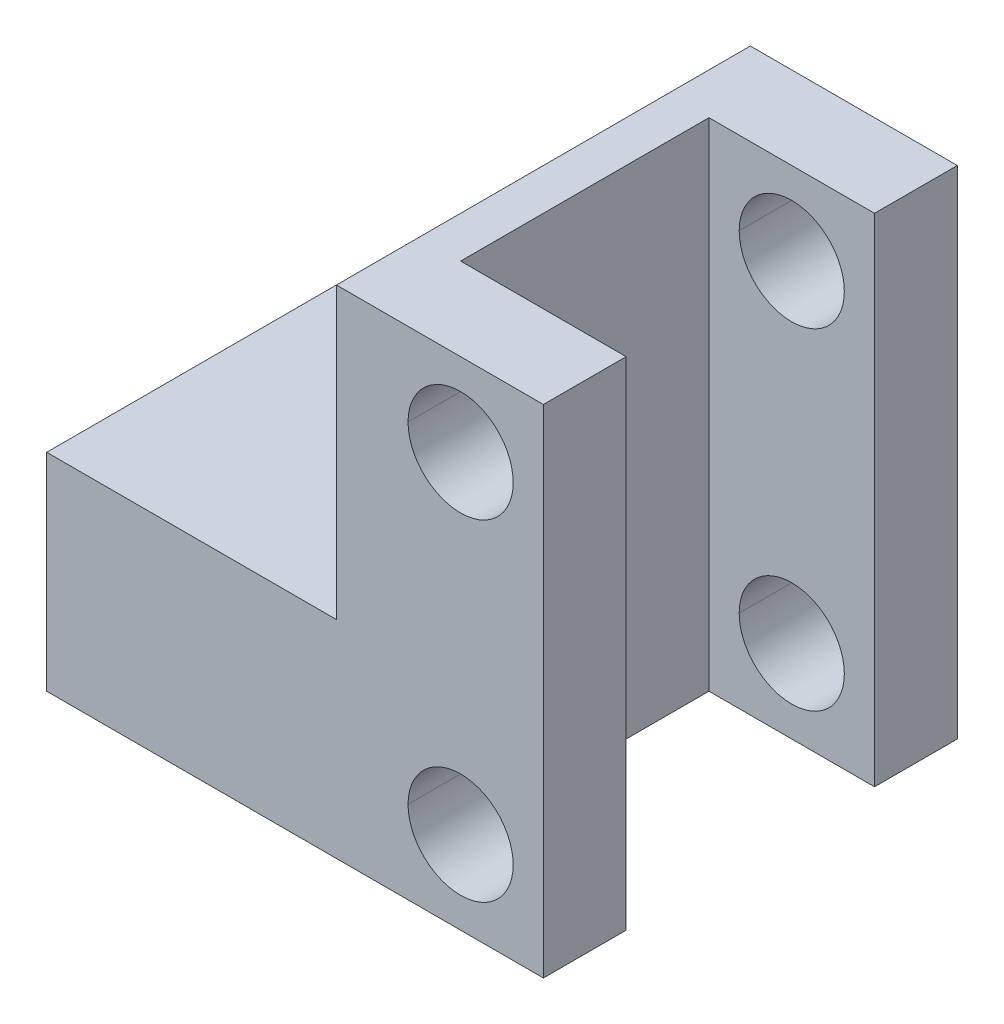
ISO-10303-21;
HEADER;
FILE_DESCRIPTION(('STEP AP214'),'2;1');
FILE_NAME('part.step','',(''),(''),'','','');
FILE_SCHEMA(('AUTOMOTIVE_DESIGN { 1 0 10303 214 1 1 1 1 }'));
ENDSEC;
DATA;
#1=APPLICATION_CONTEXT('core data for automotive mechanical design processes');
#2=APPLICATION_PROTOCOL_DEFINITION('international standard','automotive_design',2000,#1);
#3=PRODUCT_CONTEXT('',#1,'mechanical');
#4=PRODUCT('Part','Part','',(#3));
#5=PRODUCT_RELATED_PRODUCT_CATEGORY('part','',(#4));
#6=PRODUCT_DEFINITION_FORMATION('','',#4);
#7=PRODUCT_DEFINITION_CONTEXT('part definition',#1,'design');
#8=PRODUCT_DEFINITION('design','',#6,#7);
#9=PRODUCT_DEFINITION_SHAPE('','',#8);
#10=(LENGTH_UNIT() NAMED_UNIT(*) SI_UNIT(.MILLI.,.METRE.));
#11=(NAMED_UNIT(*) PLANE_ANGLE_UNIT() SI_UNIT($,.RADIAN.));
#12=(NAMED_UNIT(*) SI_UNIT($,.STERADIAN.) SOLID_ANGLE_UNIT());
#13=UNCERTAINTY_MEASURE_WITH_UNIT(LENGTH_MEASURE(1.E-05),#10,'distance_accuracy_value','');
#14=(GEOMETRIC_REPRESENTATION_CONTEXT(3) GLOBAL_UNCERTAINTY_ASSIGNED_CONTEXT((#13)) GLOBAL_UNIT_ASSIGNED_CONTEXT((#10,
#11,#12)) REPRESENTATION_CONTEXT('',''));
#15=CARTESIAN_POINT('',(0.,0.,0.));
#16=DIRECTION('',(0.,0.,1.));
#17=DIRECTION('',(1.,0.,0.));
#18=AXIS2_PLACEMENT_3D('',#15,#16,#17);
#19=CARTESIAN_POINT('',(20.,-20.,60.));
#20=DIRECTION('',(0.,0.,-1.));
#21=DIRECTION('',(-1.,0.,0.));
#22=AXIS2_PLACEMENT_3D('',#19,#20,#21);
#23=CYLINDRICAL_SURFACE('',#22,6.35);
#24=DIRECTION('',(0.,0.,-1.));
#25=VECTOR('',#24,1.);
#26=CARTESIAN_POINT('',(26.35,-20.,60.));
#27=LINE('',#26,#25);
#28=CARTESIAN_POINT('',(26.35,-20.,10.));
#29=VERTEX_POINT('',#28);
#30=CARTESIAN_POINT('',(26.35,-20.,0.));
#31=VERTEX_POINT('',#30);
#32=EDGE_CURVE('E191',#29,#31,#27,.T.);
#33=ORIENTED_EDGE('',*,*,#32,.F.);
#34=CARTESIAN_POINT('',(20.,-20.,10.));
#35=DIRECTION('',(0.,0.,1.));
#36=DIRECTION('',(-1.,0.,0.));
#37=AXIS2_PLACEMENT_3D('',#34,#35,#36);
#38=CIRCLE('',#37,6.35);
#39=CARTESIAN_POINT('',(13.65,-20.,10.));
#40=VERTEX_POINT('',#39);
#41=EDGE_CURVE('E177',#29,#40,#38,.T.);
#42=ORIENTED_EDGE('',*,*,#41,.T.);
#43=DIRECTION('',(0.,0.,-1.));
#44=VECTOR('',#43,1.);
#45=CARTESIAN_POINT('',(13.65,-20.,60.));
#46=LINE('',#45,#44);
#47=CARTESIAN_POINT('',(13.65,-20.,0.));
#48=VERTEX_POINT('',#47);
#49=EDGE_CURVE('E200',#40,#48,#46,.T.);
#50=ORIENTED_EDGE('',*,*,#49,.T.);
#51=CARTESIAN_POINT('',(20.,-20.,0.));
#52=DIRECTION('',(0.,0.,1.));
#53=DIRECTION('',(-1.,0.,0.));
#54=AXIS2_PLACEMENT_3D('',#51,#52,#53);
#55=CIRCLE('',#54,6.35);
#56=EDGE_CURVE('E192',#31,#48,#55,.T.);
#57=ORIENTED_EDGE('',*,*,#56,.F.);
#58=EDGE_LOOP('',(#33,#42,#50,#57));
#59=FACE_BOUND('',#58,.T.);
#60=ADVANCED_FACE('F16',(#59),#23,.F.);
#61=CARTESIAN_POINT('',(20.,20.,60.));
#62=DIRECTION('',(0.,0.,-1.));
#63=DIRECTION('',(-1.,0.,0.));
#64=AXIS2_PLACEMENT_3D('',#61,#62,#63);
#65=CYLINDRICAL_SURFACE('',#64,6.35);
#66=DIRECTION('',(0.,0.,-1.));
#67=VECTOR('',#66,1.);
#68=CARTESIAN_POINT('',(26.35,20.,60.));
#69=LINE('',#68,#67);
#70=CARTESIAN_POINT('',(26.35,20.,10.));
#71=VERTEX_POINT('',#70);
#72=CARTESIAN_POINT('',(26.35,20.,0.));
#73=VERTEX_POINT('',#72);
#74=EDGE_CURVE('E330',#71,#73,#69,.T.);
#75=ORIENTED_EDGE('',*,*,#74,.F.);
#76=CARTESIAN_POINT('',(20.,20.,10.));
#77=DIRECTION('',(0.,0.,1.));
#78=DIRECTION('',(-1.,0.,0.));
#79=AXIS2_PLACEMENT_3D('',#76,#77,#78);
#80=CIRCLE('',#79,6.35);
#81=CARTESIAN_POINT('',(13.65,20.,10.));
#82=VERTEX_POINT('',#81);
#83=EDGE_CURVE('E187',#71,#82,#80,.T.);
#84=ORIENTED_EDGE('',*,*,#83,.T.);
#85=DIRECTION('',(0.,0.,-1.));
#86=VECTOR('',#85,1.);
#87=CARTESIAN_POINT('',(13.65,20.,60.));
#88=LINE('',#87,#86);
#89=CARTESIAN_POINT('',(13.65,20.,0.));
#90=VERTEX_POINT('',#89);
#91=EDGE_CURVE('E216',#82,#90,#88,.T.);
#92=ORIENTED_EDGE('',*,*,#91,.T.);
#93=CARTESIAN_POINT('',(20.,20.,0.));
#94=DIRECTION('',(0.,0.,1.));
#95=DIRECTION('',(-1.,0.,0.));
#96=AXIS2_PLACEMENT_3D('',#93,#94,#95);
#97=CIRCLE('',#96,6.35);
#98=EDGE_CURVE('E245',#73,#90,#97,.T.);
#99=ORIENTED_EDGE('',*,*,#98,.F.);
#100=EDGE_LOOP('',(#75,#84,#92,#99));
#101=FACE_BOUND('',#100,.T.);
#102=ADVANCED_FACE('F620',(#101),#65,.F.);
#103=CARTESIAN_POINT('',(20.,-20.,60.));
#104=DIRECTION('',(0.,0.,-1.));
#105=DIRECTION('',(-1.,0.,0.));
#106=AXIS2_PLACEMENT_3D('',#103,#104,#105);
#107=CYLINDRICAL_SURFACE('',#106,6.35);
#108=DIRECTION('',(0.,0.,-1.));
#109=VECTOR('',#108,1.);
#110=CARTESIAN_POINT('',(26.35,-20.,60.));
#111=LINE('',#110,#109);
#112=CARTESIAN_POINT('',(26.35,-20.,-30.));
#113=VERTEX_POINT('',#112);
#114=CARTESIAN_POINT('',(26.35,-20.,-40.));
#115=VERTEX_POINT('',#114);
#116=EDGE_CURVE('E231',#113,#115,#111,.T.);
#117=ORIENTED_EDGE('',*,*,#116,.F.);
#118=CARTESIAN_POINT('',(20.,-20.,-30.));
#119=DIRECTION('',(0.,0.,1.));
#120=DIRECTION('',(-1.,0.,0.));
#121=AXIS2_PLACEMENT_3D('',#118,#119,#120);
#122=CIRCLE('',#121,6.35);
#123=CARTESIAN_POINT('',(13.65,-20.,-30.));
#124=VERTEX_POINT('',#123);
#125=EDGE_CURVE('E250',#113,#124,#122,.T.);
#126=ORIENTED_EDGE('',*,*,#125,.T.);
#127=DIRECTION('',(0.,0.,-1.));
#128=VECTOR('',#127,1.);
#129=CARTESIAN_POINT('',(13.65,-20.,60.));
#130=LINE('',#129,#128);
#131=CARTESIAN_POINT('',(13.65,-20.,-40.));
#132=VERTEX_POINT('',#131);
#133=EDGE_CURVE('E222',#124,#132,#130,.T.);
#134=ORIENTED_EDGE('',*,*,#133,.T.);
#135=CARTESIAN_POINT('',(20.,-20.,-40.));
#136=DIRECTION('',(0.,0.,1.));
#137=DIRECTION('',(1.,0.,0.));
#138=AXIS2_PLACEMENT_3D('',#135,#136,#137);
#139=CIRCLE('',#138,6.35);
#140=EDGE_CURVE('E27',#115,#132,#139,.T.);
#141=ORIENTED_EDGE('',*,*,#140,.F.);
#142=EDGE_LOOP('',(#117,#126,#134,#141));
#143=FACE_BOUND('',#142,.T.);
#144=ADVANCED_FACE('F18',(#143),#107,.F.);
#145=CARTESIAN_POINT('',(20.,20.,60.));
#146=DIRECTION('',(0.,0.,-1.));
#147=DIRECTION('',(-1.,0.,0.));
#148=AXIS2_PLACEMENT_3D('',#145,#146,#147);
#149=CYLINDRICAL_SURFACE('',#148,6.35);
#150=DIRECTION('',(0.,0.,-1.));
#151=VECTOR('',#150,1.);
#152=CARTESIAN_POINT('',(26.35,20.,60.));
#153=LINE('',#152,#151);
#154=CARTESIAN_POINT('',(26.35,20.,-30.));
#155=VERTEX_POINT('',#154);
#156=CARTESIAN_POINT('',(26.35,20.,-40.));
#157=VERTEX_POINT('',#156);
#158=EDGE_CURVE('E209',#155,#157,#153,.T.);
#159=ORIENTED_EDGE('',*,*,#158,.F.);
#160=CARTESIAN_POINT('',(20.,20.,-30.));
#161=DIRECTION('',(0.,0.,1.));
#162=DIRECTION('',(-1.,0.,0.));
#163=AXIS2_PLACEMENT_3D('',#160,#161,#162);
#164=CIRCLE('',#163,6.35);
#165=CARTESIAN_POINT('',(13.65,20.,-30.));
#166=VERTEX_POINT('',#165);
#167=EDGE_CURVE('E246',#155,#166,#164,.T.);
#168=ORIENTED_EDGE('',*,*,#167,.T.);
#169=DIRECTION('',(0.,0.,-1.));
#170=VECTOR('',#169,1.);
#171=CARTESIAN_POINT('',(13.65,20.,60.));
#172=LINE('',#171,#170);
#173=CARTESIAN_POINT('',(13.65,20.,-40.));
#174=VERTEX_POINT('',#173);
#175=EDGE_CURVE('E288',#166,#174,#172,.T.);
#176=ORIENTED_EDGE('',*,*,#175,.T.);
#177=CARTESIAN_POINT('',(20.,20.,-40.));
#178=DIRECTION('',(0.,0.,1.));
#179=DIRECTION('',(1.,0.,0.));
#180=AXIS2_PLACEMENT_3D('',#177,#178,#179);
#181=CIRCLE('',#180,6.35);
#182=EDGE_CURVE('E11',#157,#174,#181,.T.);
#183=ORIENTED_EDGE('',*,*,#182,.F.);
#184=EDGE_LOOP('',(#159,#168,#176,#183));
#185=FACE_BOUND('',#184,.T.);
#186=ADVANCED_FACE('F642',(#185),#149,.F.);
#187=CARTESIAN_POINT('',(0.,0.,-40.));
#188=DIRECTION('',(0.,0.,-1.));
#189=DIRECTION('',(0.,-1.,0.));
#190=AXIS2_PLACEMENT_3D('',#187,#188,#189);
#191=PLANE('',#190);
#192=CARTESIAN_POINT('',(20.,20.,-40.));
#193=DIRECTION('',(0.,0.,1.));
#194=DIRECTION('',(1.,0.,0.));
#195=AXIS2_PLACEMENT_3D('',#192,#193,#194);
#196=CIRCLE('',#195,6.35);
#197=EDGE_CURVE('E20',#174,#157,#196,.T.);
#198=ORIENTED_EDGE('',*,*,#197,.T.);
#199=ORIENTED_EDGE('',*,*,#182,.T.);
#200=EDGE_LOOP('',(#198,#199));
#201=FACE_BOUND('',#200,.T.);
#202=CARTESIAN_POINT('',(20.,-20.,-40.));
#203=DIRECTION('',(0.,0.,1.));
#204=DIRECTION('',(1.,0.,0.));
#205=AXIS2_PLACEMENT_3D('',#202,#203,#204);
#206=CIRCLE('',#205,6.35);
#207=EDGE_CURVE('E227',#132,#115,#206,.T.);
#208=ORIENTED_EDGE('',*,*,#207,.T.);
#209=ORIENTED_EDGE('',*,*,#140,.T.);
#210=EDGE_LOOP('',(#208,#209));
#211=FACE_BOUND('',#210,.T.);
#212=DIRECTION('',(0.,-1.,0.));
#213=VECTOR('',#212,1.);
#214=CARTESIAN_POINT('',(30.,30.,-40.));
#215=LINE('',#214,#213);
#216=CARTESIAN_POINT('',(30.,30.,-40.));
#217=VERTEX_POINT('',#216);
#218=CARTESIAN_POINT('',(30.,-30.,-40.));
#219=VERTEX_POINT('',#218);
#220=EDGE_CURVE('E249',#217,#219,#215,.T.);
#221=ORIENTED_EDGE('',*,*,#220,.T.);
#222=DIRECTION('',(-1.,0.,0.));
#223=VECTOR('',#222,1.);
#224=CARTESIAN_POINT('',(30.,-30.,-40.));
#225=LINE('',#224,#223);
#226=CARTESIAN_POINT('',(-30.,-30.,-40.));
#227=VERTEX_POINT('',#226);
#228=EDGE_CURVE('E278',#219,#227,#225,.T.);
#229=ORIENTED_EDGE('',*,*,#228,.T.);
#230=DIRECTION('',(0.,1.,0.));
#231=VECTOR('',#230,1.);
#232=CARTESIAN_POINT('',(-30.,-5.,-40.));
#233=LINE('',#232,#231);
#234=CARTESIAN_POINT('',(-30.,-5.,-40.));
#235=VERTEX_POINT('',#234);
#236=EDGE_CURVE('E260',#227,#235,#233,.T.);
#237=ORIENTED_EDGE('',*,*,#236,.T.);
#238=DIRECTION('',(1.,0.,0.));
#239=VECTOR('',#238,1.);
#240=CARTESIAN_POINT('',(5.,-5.,-40.));
#241=LINE('',#240,#239);
#242=CARTESIAN_POINT('',(5.,-5.,-40.));
#243=VERTEX_POINT('',#242);
#244=EDGE_CURVE('E244',#235,#243,#241,.T.);
#245=ORIENTED_EDGE('',*,*,#244,.T.);
#246=DIRECTION('',(0.,1.,0.));
#247=VECTOR('',#246,1.);
#248=CARTESIAN_POINT('',(5.,-5.,-40.));
#249=LINE('',#248,#247);
#250=CARTESIAN_POINT('',(5.,30.,-40.));
#251=VERTEX_POINT('',#250);
#252=EDGE_CURVE('E42',#243,#251,#249,.T.);
#253=ORIENTED_EDGE('',*,*,#252,.T.);
#254=DIRECTION('',(1.,0.,0.));
#255=VECTOR('',#254,1.);
#256=CARTESIAN_POINT('',(30.,30.,-40.));
#257=LINE('',#256,#255);
#258=EDGE_CURVE('E341',#251,#217,#257,.T.);
#259=ORIENTED_EDGE('',*,*,#258,.T.);
#260=EDGE_LOOP('',(#221,#229,#237,#245,#253,#259));
#261=FACE_BOUND('',#260,.T.);
#262=ADVANCED_FACE('F366',(#201,#211,#261),#191,.T.);
#263=CARTESIAN_POINT('',(30.,30.,-40.));
#264=DIRECTION('',(-1.,0.,0.));
#265=DIRECTION('',(0.,0.,1.));
#266=AXIS2_PLACEMENT_3D('',#263,#264,#265);
#267=PLANE('',#266);
#268=DIRECTION('',(0.,-1.,0.));
#269=VECTOR('',#268,1.);
#270=CARTESIAN_POINT('',(30.,30.,-30.));
#271=LINE('',#270,#269);
#272=CARTESIAN_POINT('',(30.,30.,-30.));
#273=VERTEX_POINT('',#272);
#274=CARTESIAN_POINT('',(30.,-30.,-30.));
#275=VERTEX_POINT('',#274);
#276=EDGE_CURVE('E234',#273,#275,#271,.T.);
#277=ORIENTED_EDGE('',*,*,#276,.T.);
#278=DIRECTION('',(0.,0.,1.));
#279=VECTOR('',#278,1.);
#280=CARTESIAN_POINT('',(30.,-30.,-40.));
#281=LINE('',#280,#279);
#282=EDGE_CURVE('E273',#219,#275,#281,.T.);
#283=ORIENTED_EDGE('',*,*,#282,.F.);
#284=ORIENTED_EDGE('',*,*,#220,.F.);
#285=DIRECTION('',(0.,0.,1.));
#286=VECTOR('',#285,1.);
#287=CARTESIAN_POINT('',(30.,30.,-40.));
#288=LINE('',#287,#286);
#289=EDGE_CURVE('E295',#217,#273,#288,.T.);
#290=ORIENTED_EDGE('',*,*,#289,.T.);
#291=EDGE_LOOP('',(#277,#283,#284,#290));
#292=FACE_BOUND('',#291,.T.);
#293=ADVANCED_FACE('F641',(#292),#267,.F.);
#294=CARTESIAN_POINT('',(0.,0.,-30.));
#295=DIRECTION('',(0.,0.,-1.));
#296=DIRECTION('',(0.,-1.,0.));
#297=AXIS2_PLACEMENT_3D('',#294,#295,#296);
#298=PLANE('',#297);
#299=CARTESIAN_POINT('',(20.,20.,-30.));
#300=DIRECTION('',(0.,0.,1.));
#301=DIRECTION('',(-1.,0.,0.));
#302=AXIS2_PLACEMENT_3D('',#299,#300,#301);
#303=CIRCLE('',#302,6.35);
#304=EDGE_CURVE('E226',#166,#155,#303,.T.);
#305=ORIENTED_EDGE('',*,*,#304,.F.);
#306=ORIENTED_EDGE('',*,*,#167,.F.);
#307=EDGE_LOOP('',(#305,#306));
#308=FACE_BOUND('',#307,.T.);
#309=CARTESIAN_POINT('',(20.,-20.,-30.));
#310=DIRECTION('',(0.,0.,1.));
#311=DIRECTION('',(-1.,0.,0.));
#312=AXIS2_PLACEMENT_3D('',#309,#310,#311);
#313=CIRCLE('',#312,6.35);
#314=EDGE_CURVE('E220',#124,#113,#313,.T.);
#315=ORIENTED_EDGE('',*,*,#314,.F.);
#316=ORIENTED_EDGE('',*,*,#125,.F.);
#317=EDGE_LOOP('',(#315,#316));
#318=FACE_BOUND('',#317,.T.);
#319=DIRECTION('',(1.,0.,0.));
#320=VECTOR('',#319,1.);
#321=CARTESIAN_POINT('',(30.,30.,-30.));
#322=LINE('',#321,#320);
#323=CARTESIAN_POINT('',(10.,30.,-30.));
#324=VERTEX_POINT('',#323);
#325=EDGE_CURVE('E255',#324,#273,#322,.T.);
#326=ORIENTED_EDGE('',*,*,#325,.F.);
#327=DIRECTION('',(0.,-1.,0.));
#328=VECTOR('',#327,1.);
#329=CARTESIAN_POINT('',(10.,30.,-30.));
#330=LINE('',#329,#328);
#331=CARTESIAN_POINT('',(10.,-30.,-30.));
#332=VERTEX_POINT('',#331);
#333=EDGE_CURVE('E235',#324,#332,#330,.T.);
#334=ORIENTED_EDGE('',*,*,#333,.T.);
#335=DIRECTION('',(-1.,0.,0.));
#336=VECTOR('',#335,1.);
#337=CARTESIAN_POINT('',(30.,-30.,-30.));
#338=LINE('',#337,#336);
#339=EDGE_CURVE('E277',#275,#332,#338,.T.);
#340=ORIENTED_EDGE('',*,*,#339,.F.);
#341=ORIENTED_EDGE('',*,*,#276,.F.);
#342=EDGE_LOOP('',(#326,#334,#340,#341));
#343=FACE_BOUND('',#342,.T.);
#344=ADVANCED_FACE('F633',(#308,#318,#343),#298,.F.);
#345=CARTESIAN_POINT('',(5.,-5.,10.));
#346=DIRECTION('',(-1.,0.,0.));
#347=DIRECTION('',(0.,1.,0.));
#348=AXIS2_PLACEMENT_3D('',#345,#346,#347);
#349=PLANE('',#348);
#350=DIRECTION('',(0.,0.,-1.));
#351=VECTOR('',#350,1.);
#352=CARTESIAN_POINT('',(5.,30.,10.));
#353=LINE('',#352,#351);
#354=CARTESIAN_POINT('',(5.,30.,10.));
#355=VERTEX_POINT('',#354);
#356=EDGE_CURVE('E272',#355,#251,#353,.T.);
#357=ORIENTED_EDGE('',*,*,#356,.T.);
#358=ORIENTED_EDGE('',*,*,#252,.F.);
#359=DIRECTION('',(0.,0.,-1.));
#360=VECTOR('',#359,1.);
#361=CARTESIAN_POINT('',(5.,-5.,10.));
#362=LINE('',#361,#360);
#363=CARTESIAN_POINT('',(5.,-5.,10.));
#364=VERTEX_POINT('',#363);
#365=EDGE_CURVE('E240',#364,#243,#362,.T.);
#366=ORIENTED_EDGE('',*,*,#365,.F.);
#367=DIRECTION('',(0.,1.,0.));
#368=VECTOR('',#367,1.);
#369=CARTESIAN_POINT('',(5.,-5.,10.));
#370=LINE('',#369,#368);
#371=EDGE_CURVE('E305',#364,#355,#370,.T.);
#372=ORIENTED_EDGE('',*,*,#371,.T.);
#373=EDGE_LOOP('',(#357,#358,#366,#372));
#374=FACE_BOUND('',#373,.T.);
#375=ADVANCED_FACE('F629',(#374),#349,.T.);
#376=CARTESIAN_POINT('',(10.,30.,10.));
#377=DIRECTION('',(1.,0.,0.));
#378=DIRECTION('',(0.,1.,0.));
#379=AXIS2_PLACEMENT_3D('',#376,#377,#378);
#380=PLANE('',#379);
#381=DIRECTION('',(0.,0.,-1.));
#382=VECTOR('',#381,1.);
#383=CARTESIAN_POINT('',(10.,30.,10.));
#384=LINE('',#383,#382);
#385=CARTESIAN_POINT('',(10.,30.,0.));
#386=VERTEX_POINT('',#385);
#387=EDGE_CURVE('E251',#386,#324,#384,.T.);
#388=ORIENTED_EDGE('',*,*,#387,.F.);
#389=DIRECTION('',(0.,-1.,0.));
#390=VECTOR('',#389,1.);
#391=CARTESIAN_POINT('',(10.,0.,0.));
#392=LINE('',#391,#390);
#393=CARTESIAN_POINT('',(10.,-30.,0.));
#394=VERTEX_POINT('',#393);
#395=EDGE_CURVE('E335',#386,#394,#392,.T.);
#396=ORIENTED_EDGE('',*,*,#395,.T.);
#397=DIRECTION('',(0.,0.,-1.));
#398=VECTOR('',#397,1.);
#399=CARTESIAN_POINT('',(10.,-30.,10.));
#400=LINE('',#399,#398);
#401=EDGE_CURVE('E299',#394,#332,#400,.T.);
#402=ORIENTED_EDGE('',*,*,#401,.T.);
#403=ORIENTED_EDGE('',*,*,#333,.F.);
#404=EDGE_LOOP('',(#388,#396,#402,#403));
#405=FACE_BOUND('',#404,.T.);
#406=ADVANCED_FACE('F417',(#405),#380,.T.);
#407=CARTESIAN_POINT('',(10.,-5.,-30.));
#408=DIRECTION('',(0.,-1.,0.));
#409=DIRECTION('',(0.,0.,-1.));
#410=AXIS2_PLACEMENT_3D('',#407,#408,#409);
#411=PLANE('',#410);
#412=DIRECTION('',(1.,0.,0.));
#413=VECTOR('',#412,1.);
#414=CARTESIAN_POINT('',(10.,-5.,10.));
#415=LINE('',#414,#413);
#416=CARTESIAN_POINT('',(-30.,-5.,10.));
#417=VERTEX_POINT('',#416);
#418=EDGE_CURVE('E188',#417,#364,#415,.T.);
#419=ORIENTED_EDGE('',*,*,#418,.T.);
#420=ORIENTED_EDGE('',*,*,#365,.T.);
#421=ORIENTED_EDGE('',*,*,#244,.F.);
#422=DIRECTION('',(0.,0.,1.));
#423=VECTOR('',#422,1.);
#424=CARTESIAN_POINT('',(-30.,-5.,-30.));
#425=LINE('',#424,#423);
#426=EDGE_CURVE('E257',#235,#417,#425,.T.);
#427=ORIENTED_EDGE('',*,*,#426,.T.);
#428=EDGE_LOOP('',(#419,#420,#421,#427));
#429=FACE_BOUND('',#428,.T.);
#430=ADVANCED_FACE('F408',(#429),#411,.F.);
#431=CARTESIAN_POINT('',(0.,0.,0.));
#432=DIRECTION('',(0.,0.,-1.));
#433=DIRECTION('',(0.,-1.,0.));
#434=AXIS2_PLACEMENT_3D('',#431,#432,#433);
#435=PLANE('',#434);
#436=CARTESIAN_POINT('',(20.,20.,0.));
#437=DIRECTION('',(0.,0.,1.));
#438=DIRECTION('',(-1.,0.,0.));
#439=AXIS2_PLACEMENT_3D('',#436,#437,#438);
#440=CIRCLE('',#439,6.35);
#441=EDGE_CURVE('E221',#90,#73,#440,.T.);
#442=ORIENTED_EDGE('',*,*,#441,.T.);
#443=ORIENTED_EDGE('',*,*,#98,.T.);
#444=EDGE_LOOP('',(#442,#443));
#445=FACE_BOUND('',#444,.T.);
#446=CARTESIAN_POINT('',(20.,-20.,0.));
#447=DIRECTION('',(0.,0.,1.));
#448=DIRECTION('',(-1.,0.,0.));
#449=AXIS2_PLACEMENT_3D('',#446,#447,#448);
#450=CIRCLE('',#449,6.35);
#451=EDGE_CURVE('E197',#48,#31,#450,.T.);
#452=ORIENTED_EDGE('',*,*,#451,.T.);
#453=ORIENTED_EDGE('',*,*,#56,.T.);
#454=EDGE_LOOP('',(#452,#453));
#455=FACE_BOUND('',#454,.T.);
#456=DIRECTION('',(1.,0.,0.));
#457=VECTOR('',#456,1.);
#458=CARTESIAN_POINT('',(-30.,-30.,0.));
#459=LINE('',#458,#457);
#460=CARTESIAN_POINT('',(30.,-30.,0.));
#461=VERTEX_POINT('',#460);
#462=EDGE_CURVE('E303',#394,#461,#459,.T.);
#463=ORIENTED_EDGE('',*,*,#462,.F.);
#464=ORIENTED_EDGE('',*,*,#395,.F.);
#465=DIRECTION('',(-1.,0.,0.));
#466=VECTOR('',#465,1.);
#467=CARTESIAN_POINT('',(-30.,30.,0.));
#468=LINE('',#467,#466);
#469=CARTESIAN_POINT('',(30.,30.,0.));
#470=VERTEX_POINT('',#469);
#471=EDGE_CURVE('E256',#470,#386,#468,.T.);
#472=ORIENTED_EDGE('',*,*,#471,.F.);
#473=DIRECTION('',(0.,1.,0.));
#474=VECTOR('',#473,1.);
#475=CARTESIAN_POINT('',(30.,-30.,0.));
#476=LINE('',#475,#474);
#477=EDGE_CURVE('E215',#461,#470,#476,.T.);
#478=ORIENTED_EDGE('',*,*,#477,.F.);
#479=EDGE_LOOP('',(#463,#464,#472,#478));
#480=FACE_BOUND('',#479,.T.);
#481=ADVANCED_FACE('F405',(#445,#455,#480),#435,.T.);
#482=CARTESIAN_POINT('',(0.,0.,10.));
#483=DIRECTION('',(0.,0.,-1.));
#484=DIRECTION('',(0.,-1.,0.));
#485=AXIS2_PLACEMENT_3D('',#482,#483,#484);
#486=PLANE('',#485);
#487=CARTESIAN_POINT('',(20.,20.,10.));
#488=DIRECTION('',(0.,0.,1.));
#489=DIRECTION('',(-1.,0.,0.));
#490=AXIS2_PLACEMENT_3D('',#487,#488,#489);
#491=CIRCLE('',#490,6.35);
#492=EDGE_CURVE('E327',#82,#71,#491,.T.);
#493=ORIENTED_EDGE('',*,*,#492,.F.);
#494=ORIENTED_EDGE('',*,*,#83,.F.);
#495=EDGE_LOOP('',(#493,#494));
#496=FACE_BOUND('',#495,.T.);
#497=CARTESIAN_POINT('',(20.,-20.,10.));
#498=DIRECTION('',(0.,0.,1.));
#499=DIRECTION('',(-1.,0.,0.));
#500=AXIS2_PLACEMENT_3D('',#497,#498,#499);
#501=CIRCLE('',#500,6.35);
#502=EDGE_CURVE('E182',#40,#29,#501,.T.);
#503=ORIENTED_EDGE('',*,*,#502,.F.);
#504=ORIENTED_EDGE('',*,*,#41,.F.);
#505=EDGE_LOOP('',(#503,#504));
#506=FACE_BOUND('',#505,.T.);
#507=DIRECTION('',(1.,0.,0.));
#508=VECTOR('',#507,1.);
#509=CARTESIAN_POINT('',(-30.,-30.,10.));
#510=LINE('',#509,#508);
#511=CARTESIAN_POINT('',(-30.,-30.,10.));
#512=VERTEX_POINT('',#511);
#513=CARTESIAN_POINT('',(30.,-30.,10.));
#514=VERTEX_POINT('',#513);
#515=EDGE_CURVE('E322',#512,#514,#510,.T.);
#516=ORIENTED_EDGE('',*,*,#515,.T.);
#517=DIRECTION('',(0.,1.,0.));
#518=VECTOR('',#517,1.);
#519=CARTESIAN_POINT('',(30.,-30.,10.));
#520=LINE('',#519,#518);
#521=CARTESIAN_POINT('',(30.,30.,10.));
#522=VERTEX_POINT('',#521);
#523=EDGE_CURVE('E214',#514,#522,#520,.T.);
#524=ORIENTED_EDGE('',*,*,#523,.T.);
#525=DIRECTION('',(-1.,0.,0.));
#526=VECTOR('',#525,1.);
#527=CARTESIAN_POINT('',(-30.,30.,10.));
#528=LINE('',#527,#526);
#529=EDGE_CURVE('E268',#522,#355,#528,.T.);
#530=ORIENTED_EDGE('',*,*,#529,.T.);
#531=ORIENTED_EDGE('',*,*,#371,.F.);
#532=ORIENTED_EDGE('',*,*,#418,.F.);
#533=DIRECTION('',(0.,-1.,0.));
#534=VECTOR('',#533,1.);
#535=CARTESIAN_POINT('',(-30.,-30.,10.));
#536=LINE('',#535,#534);
#537=EDGE_CURVE('E261',#417,#512,#536,.T.);
#538=ORIENTED_EDGE('',*,*,#537,.T.);
#539=EDGE_LOOP('',(#516,#524,#530,#531,#532,#538));
#540=FACE_BOUND('',#539,.T.);
#541=ADVANCED_FACE('F179',(#496,#506,#540),#486,.F.);
#542=CARTESIAN_POINT('',(-30.,-30.,10.));
#543=DIRECTION('',(0.,1.,0.));
#544=DIRECTION('',(1.,0.,0.));
#545=AXIS2_PLACEMENT_3D('',#542,#543,#544);
#546=PLANE('',#545);
#547=DIRECTION('',(0.,0.,-1.));
#548=VECTOR('',#547,1.);
#549=CARTESIAN_POINT('',(30.,-30.,10.));
#550=LINE('',#549,#548);
#551=EDGE_CURVE('E239',#514,#461,#550,.T.);
#552=ORIENTED_EDGE('',*,*,#551,.F.);
#553=ORIENTED_EDGE('',*,*,#515,.F.);
#554=DIRECTION('',(0.,0.,-1.));
#555=VECTOR('',#554,1.);
#556=CARTESIAN_POINT('',(-30.,-30.,10.));
#557=LINE('',#556,#555);
#558=EDGE_CURVE('E287',#512,#227,#557,.T.);
#559=ORIENTED_EDGE('',*,*,#558,.T.);
#560=ORIENTED_EDGE('',*,*,#228,.F.);
#561=ORIENTED_EDGE('',*,*,#282,.T.);
#562=ORIENTED_EDGE('',*,*,#339,.T.);
#563=ORIENTED_EDGE('',*,*,#401,.F.);
#564=ORIENTED_EDGE('',*,*,#462,.T.);
#565=EDGE_LOOP('',(#552,#553,#559,#560,#561,#562,#563,#564));
#566=FACE_BOUND('',#565,.T.);
#567=ADVANCED_FACE('F360',(#566),#546,.F.);
#568=CARTESIAN_POINT('',(-30.,-30.,10.));
#569=DIRECTION('',(1.,0.,0.));
#570=DIRECTION('',(0.,1.,0.));
#571=AXIS2_PLACEMENT_3D('',#568,#569,#570);
#572=PLANE('',#571);
#573=ORIENTED_EDGE('',*,*,#537,.F.);
#574=ORIENTED_EDGE('',*,*,#426,.F.);
#575=ORIENTED_EDGE('',*,*,#236,.F.);
#576=ORIENTED_EDGE('',*,*,#558,.F.);
#577=EDGE_LOOP('',(#573,#574,#575,#576));
#578=FACE_BOUND('',#577,.T.);
#579=ADVANCED_FACE('F364',(#578),#572,.F.);
#580=CARTESIAN_POINT('',(-30.,30.,10.));
#581=DIRECTION('',(0.,-1.,0.));
#582=DIRECTION('',(0.,0.,-1.));
#583=AXIS2_PLACEMENT_3D('',#580,#581,#582);
#584=PLANE('',#583);
#585=ORIENTED_EDGE('',*,*,#471,.T.);
#586=ORIENTED_EDGE('',*,*,#387,.T.);
#587=ORIENTED_EDGE('',*,*,#325,.T.);
#588=ORIENTED_EDGE('',*,*,#289,.F.);
#589=ORIENTED_EDGE('',*,*,#258,.F.);
#590=ORIENTED_EDGE('',*,*,#356,.F.);
#591=ORIENTED_EDGE('',*,*,#529,.F.);
#592=DIRECTION('',(0.,0.,-1.));
#593=VECTOR('',#592,1.);
#594=CARTESIAN_POINT('',(30.,30.,10.));
#595=LINE('',#594,#593);
#596=EDGE_CURVE('E211',#522,#470,#595,.T.);
#597=ORIENTED_EDGE('',*,*,#596,.T.);
#598=EDGE_LOOP('',(#585,#586,#587,#588,#589,#590,#591,#597));
#599=FACE_BOUND('',#598,.T.);
#600=ADVANCED_FACE('F420',(#599),#584,.F.);
#601=CARTESIAN_POINT('',(30.,-30.,10.));
#602=DIRECTION('',(-1.,0.,0.));
#603=DIRECTION('',(0.,0.,1.));
#604=AXIS2_PLACEMENT_3D('',#601,#602,#603);
#605=PLANE('',#604);
#606=ORIENTED_EDGE('',*,*,#477,.T.);
#607=ORIENTED_EDGE('',*,*,#596,.F.);
#608=ORIENTED_EDGE('',*,*,#523,.F.);
#609=ORIENTED_EDGE('',*,*,#551,.T.);
#610=EDGE_LOOP('',(#606,#607,#608,#609));
#611=FACE_BOUND('',#610,.T.);
#612=ADVANCED_FACE('F561',(#611),#605,.F.);
#613=CARTESIAN_POINT('',(20.,20.,60.));
#614=DIRECTION('',(0.,0.,-1.));
#615=DIRECTION('',(-1.,0.,0.));
#616=AXIS2_PLACEMENT_3D('',#613,#614,#615);
#617=CYLINDRICAL_SURFACE('',#616,6.35);
#618=ORIENTED_EDGE('',*,*,#304,.T.);
#619=ORIENTED_EDGE('',*,*,#158,.T.);
#620=ORIENTED_EDGE('',*,*,#197,.F.);
#621=ORIENTED_EDGE('',*,*,#175,.F.);
#622=EDGE_LOOP('',(#618,#619,#620,#621));
#623=FACE_BOUND('',#622,.T.);
#624=ADVANCED_FACE('F556',(#623),#617,.F.);
#625=CARTESIAN_POINT('',(20.,-20.,60.));
#626=DIRECTION('',(0.,0.,-1.));
#627=DIRECTION('',(-1.,0.,0.));
#628=AXIS2_PLACEMENT_3D('',#625,#626,#627);
#629=CYLINDRICAL_SURFACE('',#628,6.35);
#630=ORIENTED_EDGE('',*,*,#314,.T.);
#631=ORIENTED_EDGE('',*,*,#116,.T.);
#632=ORIENTED_EDGE('',*,*,#207,.F.);
#633=ORIENTED_EDGE('',*,*,#133,.F.);
#634=EDGE_LOOP('',(#630,#631,#632,#633));
#635=FACE_BOUND('',#634,.T.);
#636=ADVANCED_FACE('F560',(#635),#629,.F.);
#637=CARTESIAN_POINT('',(20.,20.,60.));
#638=DIRECTION('',(0.,0.,-1.));
#639=DIRECTION('',(-1.,0.,0.));
#640=AXIS2_PLACEMENT_3D('',#637,#638,#639);
#641=CYLINDRICAL_SURFACE('',#640,6.35);
#642=ORIENTED_EDGE('',*,*,#492,.T.);
#643=ORIENTED_EDGE('',*,*,#74,.T.);
#644=ORIENTED_EDGE('',*,*,#441,.F.);
#645=ORIENTED_EDGE('',*,*,#91,.F.);
#646=EDGE_LOOP('',(#642,#643,#644,#645));
#647=FACE_BOUND('',#646,.T.);
#648=ADVANCED_FACE('F570',(#647),#641,.F.);
#649=CARTESIAN_POINT('',(20.,-20.,60.));
#650=DIRECTION('',(0.,0.,-1.));
#651=DIRECTION('',(-1.,0.,0.));
#652=AXIS2_PLACEMENT_3D('',#649,#650,#651);
#653=CYLINDRICAL_SURFACE('',#652,6.35);
#654=ORIENTED_EDGE('',*,*,#502,.T.);
#655=ORIENTED_EDGE('',*,*,#32,.T.);
#656=ORIENTED_EDGE('',*,*,#451,.F.);
#657=ORIENTED_EDGE('',*,*,#49,.F.);
#658=EDGE_LOOP('',(#654,#655,#656,#657));
#659=FACE_BOUND('',#658,.T.);
#660=ADVANCED_FACE('F199',(#659),#653,.F.);
#661=CLOSED_SHELL('',(#60,#102,#144,#186,#262,#293,#344,#375,#406,#430,#481,#541,#567,#579,#600,
#612,#624,#636,#648,#660));
#662=MANIFOLD_SOLID_BREP('B1',#661);
#663=ADVANCED_BREP_SHAPE_REPRESENTATION('',(#18,#662),#14);
#664=SHAPE_DEFINITION_REPRESENTATION(#9,#663);
ENDSEC;
END-ISO-10303-21;
